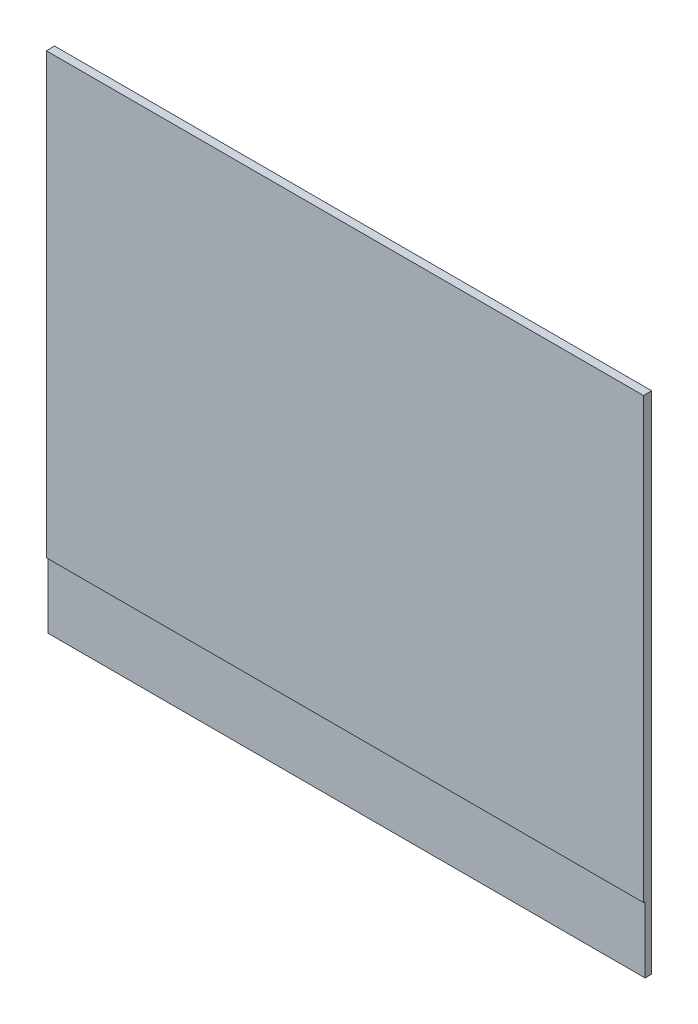
ISO-10303-21;
HEADER;
FILE_DESCRIPTION(('STEP AP214'),'2;1');
FILE_NAME('part.step','',(''),(''),'','','');
FILE_SCHEMA(('AUTOMOTIVE_DESIGN { 1 0 10303 214 1 1 1 1 }'));
ENDSEC;
DATA;
#1=APPLICATION_CONTEXT('core data for automotive mechanical design processes');
#2=APPLICATION_PROTOCOL_DEFINITION('international standard','automotive_design',2000,#1);
#3=PRODUCT_CONTEXT('',#1,'mechanical');
#4=PRODUCT('Part','Part','',(#3));
#5=PRODUCT_RELATED_PRODUCT_CATEGORY('part','',(#4));
#6=PRODUCT_DEFINITION_FORMATION('','',#4);
#7=PRODUCT_DEFINITION_CONTEXT('part definition',#1,'design');
#8=PRODUCT_DEFINITION('design','',#6,#7);
#9=PRODUCT_DEFINITION_SHAPE('','',#8);
#10=(LENGTH_UNIT() NAMED_UNIT(*) SI_UNIT(.MILLI.,.METRE.));
#11=(NAMED_UNIT(*) PLANE_ANGLE_UNIT() SI_UNIT($,.RADIAN.));
#12=(NAMED_UNIT(*) SI_UNIT($,.STERADIAN.) SOLID_ANGLE_UNIT());
#13=UNCERTAINTY_MEASURE_WITH_UNIT(LENGTH_MEASURE(1.E-05),#10,'distance_accuracy_value','');
#14=(GEOMETRIC_REPRESENTATION_CONTEXT(3) GLOBAL_UNCERTAINTY_ASSIGNED_CONTEXT((#13)) GLOBAL_UNIT_ASSIGNED_CONTEXT((#10,
#11,#12)) REPRESENTATION_CONTEXT('',''));
#15=CARTESIAN_POINT('',(0.,0.,0.));
#16=DIRECTION('',(0.,0.,1.));
#17=DIRECTION('',(1.,0.,0.));
#18=AXIS2_PLACEMENT_3D('',#15,#16,#17);
#19=CARTESIAN_POINT('',(0.,0.,1.25));
#20=DIRECTION('',(1.,0.,0.));
#21=DIRECTION('',(0.,1.,0.));
#22=AXIS2_PLACEMENT_3D('',#19,#20,#21);
#23=PLANE('',#22);
#24=DIRECTION('',(0.,-1.,0.));
#25=VECTOR('',#24,1.);
#26=CARTESIAN_POINT('',(0.,0.,1.));
#27=LINE('',#26,#25);
#28=CARTESIAN_POINT('',(0.,10.0886887918916,1.));
#29=VERTEX_POINT('',#28);
#30=CARTESIAN_POINT('',(0.,0.,1.));
#31=VERTEX_POINT('',#30);
#32=EDGE_CURVE('E123',#29,#31,#27,.T.);
#33=ORIENTED_EDGE('',*,*,#32,.F.);
#34=DIRECTION('',(0.,0.,1.));
#35=VECTOR('',#34,1.);
#36=CARTESIAN_POINT('',(0.,10.0886887918916,1.));
#37=LINE('',#36,#35);
#38=CARTESIAN_POINT('',(0.,10.0886887918916,1.25));
#39=VERTEX_POINT('',#38);
#40=EDGE_CURVE('E100',#29,#39,#37,.T.);
#41=ORIENTED_EDGE('',*,*,#40,.T.);
#42=DIRECTION('',(0.,-1.,0.));
#43=VECTOR('',#42,1.);
#44=CARTESIAN_POINT('',(0.,0.,1.25));
#45=LINE('',#44,#43);
#46=CARTESIAN_POINT('',(0.,77.,1.25));
#47=VERTEX_POINT('',#46);
#48=EDGE_CURVE('E86',#47,#39,#45,.T.);
#49=ORIENTED_EDGE('',*,*,#48,.F.);
#50=DIRECTION('',(0.,0.,-1.));
#51=VECTOR('',#50,1.);
#52=CARTESIAN_POINT('',(0.,77.,1.25));
#53=LINE('',#52,#51);
#54=CARTESIAN_POINT('',(0.,77.,0.));
#55=VERTEX_POINT('',#54);
#56=EDGE_CURVE('E79',#47,#55,#53,.T.);
#57=ORIENTED_EDGE('',*,*,#56,.T.);
#58=DIRECTION('',(0.,-1.,0.));
#59=VECTOR('',#58,1.);
#60=CARTESIAN_POINT('',(0.,0.,0.));
#61=LINE('',#60,#59);
#62=CARTESIAN_POINT('',(0.,0.,0.));
#63=VERTEX_POINT('',#62);
#64=EDGE_CURVE('E93',#55,#63,#61,.T.);
#65=ORIENTED_EDGE('',*,*,#64,.T.);
#66=DIRECTION('',(0.,0.,-1.));
#67=VECTOR('',#66,1.);
#68=CARTESIAN_POINT('',(0.,0.,1.25));
#69=LINE('',#68,#67);
#70=EDGE_CURVE('E11',#31,#63,#69,.T.);
#71=ORIENTED_EDGE('',*,*,#70,.F.);
#72=EDGE_LOOP('',(#33,#41,#49,#57,#65,#71));
#73=FACE_BOUND('',#72,.T.);
#74=ADVANCED_FACE('F35',(#73),#23,.F.);
#75=CARTESIAN_POINT('',(0.,0.,1.25));
#76=DIRECTION('',(0.,1.,0.));
#77=DIRECTION('',(0.,0.,1.));
#78=AXIS2_PLACEMENT_3D('',#75,#76,#77);
#79=PLANE('',#78);
#80=DIRECTION('',(0.,0.,-1.));
#81=VECTOR('',#80,1.);
#82=CARTESIAN_POINT('',(91.,0.,1.25));
#83=LINE('',#82,#81);
#84=CARTESIAN_POINT('',(91.,0.,1.));
#85=VERTEX_POINT('',#84);
#86=CARTESIAN_POINT('',(91.,0.,0.));
#87=VERTEX_POINT('',#86);
#88=EDGE_CURVE('E42',#85,#87,#83,.T.);
#89=ORIENTED_EDGE('',*,*,#88,.F.);
#90=DIRECTION('',(1.,0.,0.));
#91=VECTOR('',#90,1.);
#92=CARTESIAN_POINT('',(0.,0.,1.));
#93=LINE('',#92,#91);
#94=EDGE_CURVE('E121',#31,#85,#93,.T.);
#95=ORIENTED_EDGE('',*,*,#94,.F.);
#96=ORIENTED_EDGE('',*,*,#70,.T.);
#97=DIRECTION('',(1.,0.,0.));
#98=VECTOR('',#97,1.);
#99=CARTESIAN_POINT('',(0.,0.,0.));
#100=LINE('',#99,#98);
#101=EDGE_CURVE('E99',#63,#87,#100,.T.);
#102=ORIENTED_EDGE('',*,*,#101,.T.);
#103=EDGE_LOOP('',(#89,#95,#96,#102));
#104=FACE_BOUND('',#103,.T.);
#105=ADVANCED_FACE('F118',(#104),#79,.F.);
#106=CARTESIAN_POINT('',(91.,0.,1.25));
#107=DIRECTION('',(-1.,0.,0.));
#108=DIRECTION('',(0.,-1.,0.));
#109=AXIS2_PLACEMENT_3D('',#106,#107,#108);
#110=PLANE('',#109);
#111=DIRECTION('',(0.,1.,0.));
#112=VECTOR('',#111,1.);
#113=CARTESIAN_POINT('',(91.,0.,1.25));
#114=LINE('',#113,#112);
#115=CARTESIAN_POINT('',(91.,10.0886887918916,1.25));
#116=VERTEX_POINT('',#115);
#117=CARTESIAN_POINT('',(91.,77.,1.25));
#118=VERTEX_POINT('',#117);
#119=EDGE_CURVE('E143',#116,#118,#114,.T.);
#120=ORIENTED_EDGE('',*,*,#119,.F.);
#121=DIRECTION('',(0.,0.,1.));
#122=VECTOR('',#121,1.);
#123=CARTESIAN_POINT('',(91.,10.0886887918916,1.));
#124=LINE('',#123,#122);
#125=CARTESIAN_POINT('',(91.,10.0886887918916,1.));
#126=VERTEX_POINT('',#125);
#127=EDGE_CURVE('E49',#126,#116,#124,.T.);
#128=ORIENTED_EDGE('',*,*,#127,.F.);
#129=DIRECTION('',(0.,1.,0.));
#130=VECTOR('',#129,1.);
#131=CARTESIAN_POINT('',(91.,0.,1.));
#132=LINE('',#131,#130);
#133=EDGE_CURVE('E115',#85,#126,#132,.T.);
#134=ORIENTED_EDGE('',*,*,#133,.F.);
#135=ORIENTED_EDGE('',*,*,#88,.T.);
#136=DIRECTION('',(0.,1.,0.));
#137=VECTOR('',#136,1.);
#138=CARTESIAN_POINT('',(91.,0.,0.));
#139=LINE('',#138,#137);
#140=CARTESIAN_POINT('',(91.,77.,0.));
#141=VERTEX_POINT('',#140);
#142=EDGE_CURVE('E87',#87,#141,#139,.T.);
#143=ORIENTED_EDGE('',*,*,#142,.T.);
#144=DIRECTION('',(0.,0.,-1.));
#145=VECTOR('',#144,1.);
#146=CARTESIAN_POINT('',(91.,77.,1.25));
#147=LINE('',#146,#145);
#148=EDGE_CURVE('E82',#118,#141,#147,.T.);
#149=ORIENTED_EDGE('',*,*,#148,.F.);
#150=EDGE_LOOP('',(#120,#128,#134,#135,#143,#149));
#151=FACE_BOUND('',#150,.T.);
#152=ADVANCED_FACE('F112',(#151),#110,.F.);
#153=CARTESIAN_POINT('',(0.,77.,1.25));
#154=DIRECTION('',(0.,-1.,0.));
#155=DIRECTION('',(0.,0.,-1.));
#156=AXIS2_PLACEMENT_3D('',#153,#154,#155);
#157=PLANE('',#156);
#158=DIRECTION('',(-1.,0.,0.));
#159=VECTOR('',#158,1.);
#160=CARTESIAN_POINT('',(0.,77.,0.));
#161=LINE('',#160,#159);
#162=EDGE_CURVE('E76',#141,#55,#161,.T.);
#163=ORIENTED_EDGE('',*,*,#162,.T.);
#164=ORIENTED_EDGE('',*,*,#56,.F.);
#165=DIRECTION('',(-1.,0.,0.));
#166=VECTOR('',#165,1.);
#167=CARTESIAN_POINT('',(0.,77.,1.25));
#168=LINE('',#167,#166);
#169=EDGE_CURVE('E58',#118,#47,#168,.T.);
#170=ORIENTED_EDGE('',*,*,#169,.F.);
#171=ORIENTED_EDGE('',*,*,#148,.T.);
#172=EDGE_LOOP('',(#163,#164,#170,#171));
#173=FACE_BOUND('',#172,.T.);
#174=ADVANCED_FACE('F78',(#173),#157,.F.);
#175=CARTESIAN_POINT('',(0.,0.,1.25));
#176=DIRECTION('',(0.,0.,-1.));
#177=DIRECTION('',(-1.,0.,0.));
#178=AXIS2_PLACEMENT_3D('',#175,#176,#177);
#179=PLANE('',#178);
#180=ORIENTED_EDGE('',*,*,#48,.T.);
#181=DIRECTION('',(-1.,0.,0.));
#182=VECTOR('',#181,1.);
#183=CARTESIAN_POINT('',(0.,10.0886887918916,1.25));
#184=LINE('',#183,#182);
#185=EDGE_CURVE('E135',#116,#39,#184,.T.);
#186=ORIENTED_EDGE('',*,*,#185,.F.);
#187=ORIENTED_EDGE('',*,*,#119,.T.);
#188=ORIENTED_EDGE('',*,*,#169,.T.);
#189=EDGE_LOOP('',(#180,#186,#187,#188));
#190=FACE_BOUND('',#189,.T.);
#191=ADVANCED_FACE('F144',(#190),#179,.F.);
#192=CARTESIAN_POINT('',(0.,0.,0.));
#193=DIRECTION('',(0.,0.,-1.));
#194=DIRECTION('',(-1.,0.,0.));
#195=AXIS2_PLACEMENT_3D('',#192,#193,#194);
#196=PLANE('',#195);
#197=ORIENTED_EDGE('',*,*,#64,.F.);
#198=ORIENTED_EDGE('',*,*,#162,.F.);
#199=ORIENTED_EDGE('',*,*,#142,.F.);
#200=ORIENTED_EDGE('',*,*,#101,.F.);
#201=EDGE_LOOP('',(#197,#198,#199,#200));
#202=FACE_BOUND('',#201,.T.);
#203=ADVANCED_FACE('F97',(#202),#196,.T.);
#204=CARTESIAN_POINT('',(0.,10.0886887918916,1.));
#205=DIRECTION('',(0.,1.,0.));
#206=DIRECTION('',(0.,0.,1.));
#207=AXIS2_PLACEMENT_3D('',#204,#205,#206);
#208=PLANE('',#207);
#209=ORIENTED_EDGE('',*,*,#185,.T.);
#210=ORIENTED_EDGE('',*,*,#40,.F.);
#211=DIRECTION('',(-1.,0.,0.));
#212=VECTOR('',#211,1.);
#213=CARTESIAN_POINT('',(0.,10.0886887918916,1.));
#214=LINE('',#213,#212);
#215=EDGE_CURVE('E134',#126,#29,#214,.T.);
#216=ORIENTED_EDGE('',*,*,#215,.F.);
#217=ORIENTED_EDGE('',*,*,#127,.T.);
#218=EDGE_LOOP('',(#209,#210,#216,#217));
#219=FACE_BOUND('',#218,.T.);
#220=ADVANCED_FACE('F133',(#219),#208,.F.);
#221=CARTESIAN_POINT('',(0.,0.,1.));
#222=DIRECTION('',(0.,0.,-1.));
#223=DIRECTION('',(-1.,0.,0.));
#224=AXIS2_PLACEMENT_3D('',#221,#222,#223);
#225=PLANE('',#224);
#226=ORIENTED_EDGE('',*,*,#32,.T.);
#227=ORIENTED_EDGE('',*,*,#94,.T.);
#228=ORIENTED_EDGE('',*,*,#133,.T.);
#229=ORIENTED_EDGE('',*,*,#215,.T.);
#230=EDGE_LOOP('',(#226,#227,#228,#229));
#231=FACE_BOUND('',#230,.T.);
#232=ADVANCED_FACE('F136',(#231),#225,.F.);
#233=CLOSED_SHELL('',(#74,#105,#152,#174,#191,#203,#220,#232));
#234=MANIFOLD_SOLID_BREP('B2',#233);
#235=ADVANCED_BREP_SHAPE_REPRESENTATION('',(#18,#234),#14);
#236=SHAPE_DEFINITION_REPRESENTATION(#9,#235);
ENDSEC;
END-ISO-10303-21;
